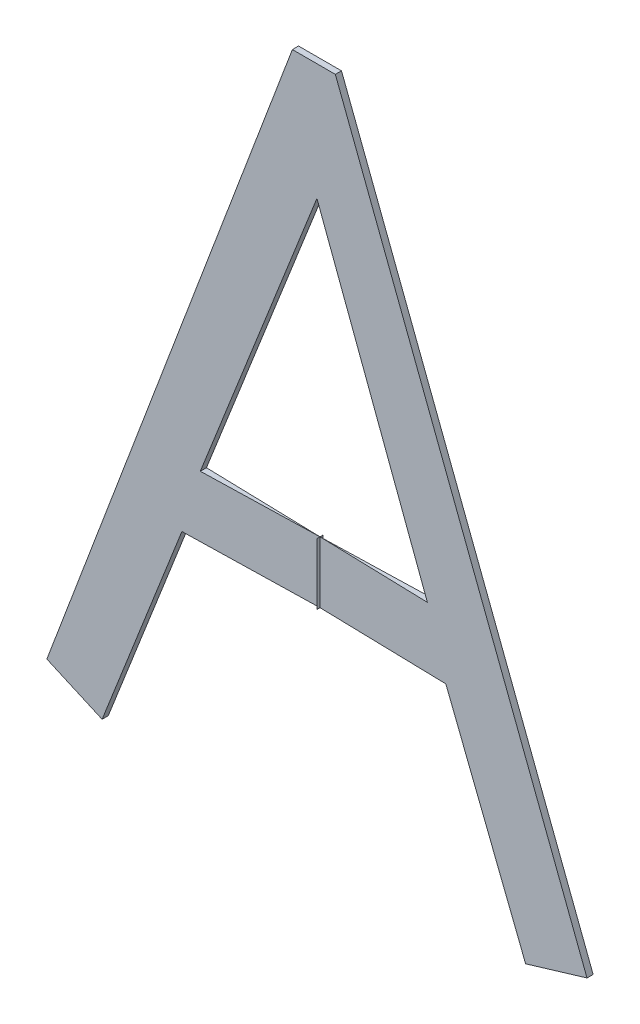
ISO-10303-21;
HEADER;
FILE_DESCRIPTION(('STEP AP214'),'2;1');
FILE_NAME('part.step','',(''),(''),'','','');
FILE_SCHEMA(('AUTOMOTIVE_DESIGN { 1 0 10303 214 1 1 1 1 }'));
ENDSEC;
DATA;
#1=APPLICATION_CONTEXT('core data for automotive mechanical design processes');
#2=APPLICATION_PROTOCOL_DEFINITION('international standard','automotive_design',2000,#1);
#3=PRODUCT_CONTEXT('',#1,'mechanical');
#4=PRODUCT('Part','Part','',(#3));
#5=PRODUCT_RELATED_PRODUCT_CATEGORY('part','',(#4));
#6=PRODUCT_DEFINITION_FORMATION('','',#4);
#7=PRODUCT_DEFINITION_CONTEXT('part definition',#1,'design');
#8=PRODUCT_DEFINITION('design','',#6,#7);
#9=PRODUCT_DEFINITION_SHAPE('','',#8);
#10=(LENGTH_UNIT() NAMED_UNIT(*) SI_UNIT(.MILLI.,.METRE.));
#11=(NAMED_UNIT(*) PLANE_ANGLE_UNIT() SI_UNIT($,.RADIAN.));
#12=(NAMED_UNIT(*) SI_UNIT($,.STERADIAN.) SOLID_ANGLE_UNIT());
#13=UNCERTAINTY_MEASURE_WITH_UNIT(LENGTH_MEASURE(1.E-05),#10,'distance_accuracy_value','');
#14=(GEOMETRIC_REPRESENTATION_CONTEXT(3) GLOBAL_UNCERTAINTY_ASSIGNED_CONTEXT((#13)) GLOBAL_UNIT_ASSIGNED_CONTEXT((#10,
#11,#12)) REPRESENTATION_CONTEXT('',''));
#15=CARTESIAN_POINT('',(0.,0.,0.));
#16=DIRECTION('',(0.,0.,1.));
#17=DIRECTION('',(1.,0.,0.));
#18=AXIS2_PLACEMENT_3D('',#15,#16,#17);
#19=CARTESIAN_POINT('',(-0.3499993,-0.5499989,0.01));
#20=DIRECTION('',(0.,0.,1.));
#21=DIRECTION('',(1.,0.,0.));
#22=AXIS2_PLACEMENT_3D('',#19,#20,#21);
#23=PLANE('',#22);
#24=DIRECTION('',(0.913811548620257,-0.406138466053448,0.));
#25=VECTOR('',#24,1.);
#26=CARTESIAN_POINT('',(-0.43999912,-0.50999898,0.01));
#27=LINE('',#26,#25);
#28=CARTESIAN_POINT('',(-0.43999912,-0.50999898,0.01));
#29=VERTEX_POINT('',#28);
#30=CARTESIAN_POINT('',(-0.3499993,-0.5499989,0.01));
#31=VERTEX_POINT('',#30);
#32=EDGE_CURVE('P0_E170',#29,#31,#27,.T.);
#33=ORIENTED_EDGE('',*,*,#32,.T.);
#34=DIRECTION('',(0.366524518382491,0.930408392817092,0.));
#35=VECTOR('',#34,1.);
#36=CARTESIAN_POINT('',(-0.3499993,-0.5499989,0.01));
#37=LINE('',#36,#35);
#38=CARTESIAN_POINT('',(-0.21999956000007,-0.219999559999986,0.01));
#39=VERTEX_POINT('',#38);
#40=EDGE_CURVE('P0_E167',#31,#39,#37,.T.);
#41=ORIENTED_EDGE('',*,*,#40,.T.);
#42=DIRECTION('',(1.,0.,0.));
#43=VECTOR('',#42,1.);
#44=CARTESIAN_POINT('',(-0.3499993,-0.21999956,0.01));
#45=LINE('',#44,#43);
#46=CARTESIAN_POINT('',(0.,-0.21999956,0.005));
#47=VERTEX_POINT('',#46);
#48=EDGE_CURVE('P0_E190',#39,#47,#45,.T.);
#49=ORIENTED_EDGE('',*,*,#48,.T.);
#50=DIRECTION('',(1.,0.,0.));
#51=VECTOR('',#50,1.);
#52=CARTESIAN_POINT('',(-0.3499993,-0.21999956,0.01));
#53=LINE('',#52,#51);
#54=CARTESIAN_POINT('',(0.21000212,-0.21999956,0.01));
#55=VERTEX_POINT('',#54);
#56=EDGE_CURVE('P0_E188',#47,#55,#53,.T.);
#57=ORIENTED_EDGE('',*,*,#56,.T.);
#58=DIRECTION('',(0.366524518382491,-0.930408392817092,0.));
#59=VECTOR('',#58,1.);
#60=CARTESIAN_POINT('',(0.21000212,-0.21999956,0.01));
#61=LINE('',#60,#59);
#62=CARTESIAN_POINT('',(0.34000186,-0.5499989,0.01));
#63=VERTEX_POINT('',#62);
#64=EDGE_CURVE('P0_E185',#55,#63,#61,.T.);
#65=ORIENTED_EDGE('',*,*,#64,.T.);
#66=DIRECTION('',(0.957826285221152,0.287347885566345,0.));
#67=VECTOR('',#66,1.);
#68=CARTESIAN_POINT('',(0.34000186,-0.5499989,0.01));
#69=LINE('',#68,#67);
#70=CARTESIAN_POINT('',(0.44000166,-0.51999896,0.01));
#71=VERTEX_POINT('',#70);
#72=EDGE_CURVE('P0_E182',#63,#71,#69,.T.);
#73=ORIENTED_EDGE('',*,*,#72,.T.);
#74=DIRECTION('',(-0.357810384585248,0.933794264644497,0.));
#75=VECTOR('',#74,1.);
#76=CARTESIAN_POINT('',(0.44000166,-0.51999896,0.01));
#77=LINE('',#76,#75);
#78=CARTESIAN_POINT('',(0.0299999400000101,0.55000144,0.01));
#79=VERTEX_POINT('',#78);
#80=EDGE_CURVE('P0_E179',#71,#79,#77,.T.);
#81=ORIENTED_EDGE('',*,*,#80,.T.);
#82=DIRECTION('',(1.,0.,0.));
#83=VECTOR('',#82,1.);
#84=CARTESIAN_POINT('',(-0.3499993,0.55000144,0.01));
#85=LINE('',#84,#83);
#86=CARTESIAN_POINT('',(-0.03999991999999,0.55000144,0.01));
#87=VERTEX_POINT('',#86);
#88=EDGE_CURVE('P0_E176',#79,#87,#85,.F.);
#89=ORIENTED_EDGE('',*,*,#88,.T.);
#90=DIRECTION('',(-0.353056511883147,-0.935601998403651,0.));
#91=VECTOR('',#90,1.);
#92=CARTESIAN_POINT('',(-0.03999991999999,0.55000144,0.01));
#93=LINE('',#92,#91);
#94=EDGE_CURVE('P0_E173',#87,#29,#93,.T.);
#95=ORIENTED_EDGE('',*,*,#94,.T.);
#96=EDGE_LOOP('',(#33,#41,#49,#57,#65,#73,#81,#89,#95));
#97=FACE_BOUND('',#96,.T.);
#98=DIRECTION('',(0.351126156502094,-0.936328159471916,0.));
#99=VECTOR('',#98,1.);
#100=CARTESIAN_POINT('',(0.,0.36000182,0.01));
#101=LINE('',#100,#99);
#102=CARTESIAN_POINT('',(0.,0.36000182,0.01));
#103=VERTEX_POINT('',#102);
#104=CARTESIAN_POINT('',(0.18000218,-0.11999976,0.01));
#105=VERTEX_POINT('',#104);
#106=EDGE_CURVE('P0_E201',#103,#105,#101,.T.);
#107=ORIENTED_EDGE('',*,*,#106,.T.);
#108=DIRECTION('',(1.,0.,0.));
#109=VECTOR('',#108,1.);
#110=CARTESIAN_POINT('',(-0.3499993,-0.11999976,0.01));
#111=LINE('',#110,#109);
#112=CARTESIAN_POINT('',(0.,-0.11999976,0.005));
#113=VERTEX_POINT('',#112);
#114=EDGE_CURVE('P0_E107',#105,#113,#111,.F.);
#115=ORIENTED_EDGE('',*,*,#114,.T.);
#116=DIRECTION('',(1.,0.,0.));
#117=VECTOR('',#116,1.);
#118=CARTESIAN_POINT('',(-0.3499993,-0.11999976,0.01));
#119=LINE('',#118,#117);
#120=CARTESIAN_POINT('',(-0.18999962,-0.11999976,0.01));
#121=VERTEX_POINT('',#120);
#122=EDGE_CURVE('P0_E105',#113,#121,#119,.F.);
#123=ORIENTED_EDGE('',*,*,#122,.T.);
#124=DIRECTION('',(0.368046767241236,0.929807279560273,0.));
#125=VECTOR('',#124,1.);
#126=CARTESIAN_POINT('',(-0.18999962,-0.11999976,0.01));
#127=LINE('',#126,#125);
#128=EDGE_CURVE('P0_E101',#121,#103,#127,.T.);
#129=ORIENTED_EDGE('',*,*,#128,.T.);
#130=EDGE_LOOP('',(#107,#115,#123,#129));
#131=FACE_BOUND('',#130,.T.);
#132=ADVANCED_FACE('P0_F17',(#97,#131),#23,.T.);
#133=CARTESIAN_POINT('',(0.,-0.11999976,0.));
#134=DIRECTION('',(0.,-1.,0.));
#135=DIRECTION('',(0.,0.,-1.));
#136=AXIS2_PLACEMENT_3D('',#133,#134,#135);
#137=PLANE('',#136);
#138=DIRECTION('',(0.,0.,1.));
#139=VECTOR('',#138,1.);
#140=CARTESIAN_POINT('',(-0.18999962,-0.11999976,0.));
#141=LINE('',#140,#139);
#142=CARTESIAN_POINT('',(-0.18999962,-0.11999976,0.));
#143=VERTEX_POINT('',#142);
#144=EDGE_CURVE('P0_E112',#143,#121,#141,.T.);
#145=ORIENTED_EDGE('',*,*,#144,.T.);
#146=ORIENTED_EDGE('',*,*,#122,.F.);
#147=DIRECTION('',(1.,0.,0.));
#148=VECTOR('',#147,1.);
#149=CARTESIAN_POINT('',(0.,-0.11999976,0.));
#150=LINE('',#149,#148);
#151=EDGE_CURVE('P0_E121',#113,#143,#150,.F.);
#152=ORIENTED_EDGE('',*,*,#151,.T.);
#153=EDGE_LOOP('',(#145,#146,#152));
#154=FACE_BOUND('',#153,.T.);
#155=ADVANCED_FACE('P0_F120',(#154),#137,.F.);
#156=CARTESIAN_POINT('',(-0.18999962,-0.11999976,0.));
#157=DIRECTION('',(-0.929807279560317,0.368046767241125,0.));
#158=DIRECTION('',(-0.368046767241125,-0.929807279560317,0.));
#159=AXIS2_PLACEMENT_3D('',#156,#157,#158);
#160=PLANE('',#159);
#161=DIRECTION('',(0.,0.,1.));
#162=VECTOR('',#161,1.);
#163=CARTESIAN_POINT('',(0.,0.36000182,0.));
#164=LINE('',#163,#162);
#165=CARTESIAN_POINT('',(0.,0.360001820000043,0.));
#166=VERTEX_POINT('',#165);
#167=EDGE_CURVE('P0_E118',#166,#103,#164,.T.);
#168=ORIENTED_EDGE('',*,*,#167,.T.);
#169=ORIENTED_EDGE('',*,*,#128,.F.);
#170=ORIENTED_EDGE('',*,*,#144,.F.);
#171=DIRECTION('',(-0.368046767241125,-0.929807279560317,0.));
#172=VECTOR('',#171,1.);
#173=CARTESIAN_POINT('',(-0.18999962,-0.11999976,0.));
#174=LINE('',#173,#172);
#175=EDGE_CURVE('P0_E161',#143,#166,#174,.F.);
#176=ORIENTED_EDGE('',*,*,#175,.T.);
#177=EDGE_LOOP('',(#168,#169,#170,#176));
#178=FACE_BOUND('',#177,.T.);
#179=ADVANCED_FACE('P0_F115',(#178),#160,.F.);
#180=CARTESIAN_POINT('',(0.,0.36000182,0.));
#181=DIRECTION('',(0.936328159471958,0.351126156501984,0.));
#182=DIRECTION('',(-0.351126156501984,0.936328159471958,0.));
#183=AXIS2_PLACEMENT_3D('',#180,#181,#182);
#184=PLANE('',#183);
#185=DIRECTION('',(0.,0.,-1.));
#186=VECTOR('',#185,1.);
#187=CARTESIAN_POINT('',(0.18000218,-0.11999976,0.));
#188=LINE('',#187,#186);
#189=CARTESIAN_POINT('',(0.180002179999968,-0.11999976,0.));
#190=VERTEX_POINT('',#189);
#191=EDGE_CURVE('P0_E198',#190,#105,#188,.F.);
#192=ORIENTED_EDGE('',*,*,#191,.T.);
#193=ORIENTED_EDGE('',*,*,#106,.F.);
#194=ORIENTED_EDGE('',*,*,#167,.F.);
#195=DIRECTION('',(-0.351126156501984,0.936328159471958,0.));
#196=VECTOR('',#195,1.);
#197=CARTESIAN_POINT('',(0.,0.36000182,0.));
#198=LINE('',#197,#196);
#199=EDGE_CURVE('P0_E156',#166,#190,#198,.F.);
#200=ORIENTED_EDGE('',*,*,#199,.T.);
#201=EDGE_LOOP('',(#192,#193,#194,#200));
#202=FACE_BOUND('',#201,.T.);
#203=ADVANCED_FACE('P0_F286',(#202),#184,.F.);
#204=CARTESIAN_POINT('',(0.18000218,-0.11999976,0.));
#205=DIRECTION('',(0.,-1.,0.));
#206=DIRECTION('',(0.,0.,-1.));
#207=AXIS2_PLACEMENT_3D('',#204,#205,#206);
#208=PLANE('',#207);
#209=ORIENTED_EDGE('',*,*,#114,.F.);
#210=ORIENTED_EDGE('',*,*,#191,.F.);
#211=DIRECTION('',(1.,0.,0.));
#212=VECTOR('',#211,1.);
#213=CARTESIAN_POINT('',(0.18000218,-0.11999976,0.));
#214=LINE('',#213,#212);
#215=EDGE_CURVE('P0_E151',#190,#113,#214,.F.);
#216=ORIENTED_EDGE('',*,*,#215,.T.);
#217=EDGE_LOOP('',(#209,#210,#216));
#218=FACE_BOUND('',#217,.T.);
#219=ADVANCED_FACE('P0_F283',(#218),#208,.F.);
#220=CARTESIAN_POINT('',(-0.21999956,-0.21999956,0.));
#221=DIRECTION('',(0.,1.,0.));
#222=DIRECTION('',(0.,0.,1.));
#223=AXIS2_PLACEMENT_3D('',#220,#221,#222);
#224=PLANE('',#223);
#225=ORIENTED_EDGE('',*,*,#48,.F.);
#226=DIRECTION('',(0.,0.,1.));
#227=VECTOR('',#226,1.);
#228=CARTESIAN_POINT('',(-0.21999956000014,-0.219999559999945,0.));
#229=LINE('',#228,#227);
#230=CARTESIAN_POINT('',(-0.21999956000015,-0.219999559999973,0.));
#231=VERTEX_POINT('',#230);
#232=EDGE_CURVE('P0_E164',#39,#231,#229,.F.);
#233=ORIENTED_EDGE('',*,*,#232,.T.);
#234=DIRECTION('',(1.,0.,0.));
#235=VECTOR('',#234,1.);
#236=CARTESIAN_POINT('',(-0.21999956,-0.21999956,0.));
#237=LINE('',#236,#235);
#238=EDGE_CURVE('P0_E146',#231,#47,#237,.T.);
#239=ORIENTED_EDGE('',*,*,#238,.T.);
#240=EDGE_LOOP('',(#225,#233,#239));
#241=FACE_BOUND('',#240,.T.);
#242=ADVANCED_FACE('P0_F221',(#241),#224,.F.);
#243=CARTESIAN_POINT('',(0.,-0.21999956,0.));
#244=DIRECTION('',(0.,1.,0.));
#245=DIRECTION('',(0.,0.,1.));
#246=AXIS2_PLACEMENT_3D('',#243,#244,#245);
#247=PLANE('',#246);
#248=DIRECTION('',(0.,0.,1.));
#249=VECTOR('',#248,1.);
#250=CARTESIAN_POINT('',(0.21000212,-0.21999956,0.));
#251=LINE('',#250,#249);
#252=CARTESIAN_POINT('',(0.21000212,-0.21999956,0.));
#253=VERTEX_POINT('',#252);
#254=EDGE_CURVE('P0_E187',#253,#55,#251,.T.);
#255=ORIENTED_EDGE('',*,*,#254,.T.);
#256=ORIENTED_EDGE('',*,*,#56,.F.);
#257=DIRECTION('',(1.,0.,0.));
#258=VECTOR('',#257,1.);
#259=CARTESIAN_POINT('',(0.,-0.21999956,0.));
#260=LINE('',#259,#258);
#261=EDGE_CURVE('P0_E143',#47,#253,#260,.T.);
#262=ORIENTED_EDGE('',*,*,#261,.T.);
#263=EDGE_LOOP('',(#255,#256,#262));
#264=FACE_BOUND('',#263,.T.);
#265=ADVANCED_FACE('P0_F253',(#264),#247,.F.);
#266=CARTESIAN_POINT('',(0.21000212,-0.21999956,0.));
#267=DIRECTION('',(0.930408392817247,0.366524518382097,0.));
#268=DIRECTION('',(-0.366524518382097,0.930408392817247,0.));
#269=AXIS2_PLACEMENT_3D('',#266,#267,#268);
#270=PLANE('',#269);
#271=DIRECTION('',(0.,0.,1.));
#272=VECTOR('',#271,1.);
#273=CARTESIAN_POINT('',(0.34000186,-0.5499989,0.));
#274=LINE('',#273,#272);
#275=CARTESIAN_POINT('',(0.340001859999928,-0.549998900000022,0.));
#276=VERTEX_POINT('',#275);
#277=EDGE_CURVE('P0_E184',#276,#63,#274,.T.);
#278=ORIENTED_EDGE('',*,*,#277,.T.);
#279=ORIENTED_EDGE('',*,*,#64,.F.);
#280=ORIENTED_EDGE('',*,*,#254,.F.);
#281=DIRECTION('',(-0.366524518382097,0.930408392817247,0.));
#282=VECTOR('',#281,1.);
#283=CARTESIAN_POINT('',(0.21000212,-0.21999956,0.));
#284=LINE('',#283,#282);
#285=EDGE_CURVE('P0_E140',#253,#276,#284,.F.);
#286=ORIENTED_EDGE('',*,*,#285,.T.);
#287=EDGE_LOOP('',(#278,#279,#280,#286));
#288=FACE_BOUND('',#287,.T.);
#289=ADVANCED_FACE('P0_F250',(#288),#270,.F.);
#290=CARTESIAN_POINT('',(0.34000186,-0.5499989,0.));
#291=DIRECTION('',(-0.28734788556607,0.957826285221234,0.));
#292=DIRECTION('',(-0.957826285221234,-0.28734788556607,0.));
#293=AXIS2_PLACEMENT_3D('',#290,#291,#292);
#294=PLANE('',#293);
#295=DIRECTION('',(0.,0.,1.));
#296=VECTOR('',#295,1.);
#297=CARTESIAN_POINT('',(0.44000166,-0.51999896,0.));
#298=LINE('',#297,#296);
#299=CARTESIAN_POINT('',(0.440001660000005,-0.519998960000014,0.));
#300=VERTEX_POINT('',#299);
#301=EDGE_CURVE('P0_E181',#300,#71,#298,.T.);
#302=ORIENTED_EDGE('',*,*,#301,.T.);
#303=ORIENTED_EDGE('',*,*,#72,.F.);
#304=ORIENTED_EDGE('',*,*,#277,.F.);
#305=DIRECTION('',(-0.957826285221234,-0.28734788556607,0.));
#306=VECTOR('',#305,1.);
#307=CARTESIAN_POINT('',(0.34000186,-0.5499989,0.));
#308=LINE('',#307,#306);
#309=EDGE_CURVE('P0_E137',#276,#300,#308,.F.);
#310=ORIENTED_EDGE('',*,*,#309,.T.);
#311=EDGE_LOOP('',(#302,#303,#304,#310));
#312=FACE_BOUND('',#311,.T.);
#313=ADVANCED_FACE('P0_F246',(#312),#294,.F.);
#314=CARTESIAN_POINT('',(0.44000166,-0.51999896,0.));
#315=DIRECTION('',(-0.933794264644644,-0.357810384584864,0.));
#316=DIRECTION('',(0.357810384584864,-0.933794264644644,0.));
#317=AXIS2_PLACEMENT_3D('',#314,#315,#316);
#318=PLANE('',#317);
#319=DIRECTION('',(0.,0.,-1.));
#320=VECTOR('',#319,1.);
#321=CARTESIAN_POINT('',(0.02999994000001,0.55000144,0.));
#322=LINE('',#321,#320);
#323=CARTESIAN_POINT('',(0.0299999400002628,0.55000144,0.));
#324=VERTEX_POINT('',#323);
#325=EDGE_CURVE('P0_E178',#324,#79,#322,.F.);
#326=ORIENTED_EDGE('',*,*,#325,.T.);
#327=ORIENTED_EDGE('',*,*,#80,.F.);
#328=ORIENTED_EDGE('',*,*,#301,.F.);
#329=DIRECTION('',(0.357810384584864,-0.933794264644644,0.));
#330=VECTOR('',#329,1.);
#331=CARTESIAN_POINT('',(0.44000166,-0.51999896,0.));
#332=LINE('',#331,#330);
#333=EDGE_CURVE('P0_E134',#300,#324,#332,.F.);
#334=ORIENTED_EDGE('',*,*,#333,.T.);
#335=EDGE_LOOP('',(#326,#327,#328,#334));
#336=FACE_BOUND('',#335,.T.);
#337=ADVANCED_FACE('P0_F242',(#336),#318,.F.);
#338=CARTESIAN_POINT('',(0.02999994000001,0.55000144,0.));
#339=DIRECTION('',(0.,-1.,0.));
#340=DIRECTION('',(0.,0.,-1.));
#341=AXIS2_PLACEMENT_3D('',#338,#339,#340);
#342=PLANE('',#341);
#343=DIRECTION('',(0.,0.,1.));
#344=VECTOR('',#343,1.);
#345=CARTESIAN_POINT('',(-0.03999991999999,0.55000144,0.));
#346=LINE('',#345,#344);
#347=CARTESIAN_POINT('',(-0.03999991999999,0.55000144,0.));
#348=VERTEX_POINT('',#347);
#349=EDGE_CURVE('P0_E175',#348,#87,#346,.T.);
#350=ORIENTED_EDGE('',*,*,#349,.T.);
#351=ORIENTED_EDGE('',*,*,#88,.F.);
#352=ORIENTED_EDGE('',*,*,#325,.F.);
#353=DIRECTION('',(1.,0.,0.));
#354=VECTOR('',#353,1.);
#355=CARTESIAN_POINT('',(0.02999994000001,0.55000144,0.));
#356=LINE('',#355,#354);
#357=EDGE_CURVE('P0_E131',#324,#348,#356,.F.);
#358=ORIENTED_EDGE('',*,*,#357,.T.);
#359=EDGE_LOOP('',(#350,#351,#352,#358));
#360=FACE_BOUND('',#359,.T.);
#361=ADVANCED_FACE('P0_F238',(#360),#342,.F.);
#362=CARTESIAN_POINT('',(-0.03999991999999,0.55000144,0.));
#363=DIRECTION('',(0.935601998403743,-0.353056511882903,0.));
#364=DIRECTION('',(0.353056511882903,0.935601998403743,0.));
#365=AXIS2_PLACEMENT_3D('',#362,#363,#364);
#366=PLANE('',#365);
#367=DIRECTION('',(0.,0.,1.));
#368=VECTOR('',#367,1.);
#369=CARTESIAN_POINT('',(-0.43999912,-0.50999898,0.));
#370=LINE('',#369,#368);
#371=CARTESIAN_POINT('',(-0.439999119999865,-0.50999898000006,0.));
#372=VERTEX_POINT('',#371);
#373=EDGE_CURVE('P0_E172',#372,#29,#370,.T.);
#374=ORIENTED_EDGE('',*,*,#373,.T.);
#375=ORIENTED_EDGE('',*,*,#94,.F.);
#376=ORIENTED_EDGE('',*,*,#349,.F.);
#377=DIRECTION('',(0.353056511882903,0.935601998403743,0.));
#378=VECTOR('',#377,1.);
#379=CARTESIAN_POINT('',(-0.03999991999999,0.55000144,0.));
#380=LINE('',#379,#378);
#381=EDGE_CURVE('P0_E128',#348,#372,#380,.F.);
#382=ORIENTED_EDGE('',*,*,#381,.T.);
#383=EDGE_LOOP('',(#374,#375,#376,#382));
#384=FACE_BOUND('',#383,.T.);
#385=ADVANCED_FACE('P0_F234',(#384),#366,.F.);
#386=CARTESIAN_POINT('',(-0.43999912,-0.50999898,0.));
#387=DIRECTION('',(0.406138466053169,0.913811548620381,0.));
#388=DIRECTION('',(-0.913811548620381,0.406138466053169,0.));
#389=AXIS2_PLACEMENT_3D('',#386,#387,#388);
#390=PLANE('',#389);
#391=DIRECTION('',(0.,0.,1.));
#392=VECTOR('',#391,1.);
#393=CARTESIAN_POINT('',(-0.3499993,-0.5499989,0.));
#394=LINE('',#393,#392);
#395=CARTESIAN_POINT('',(-0.349999299999995,-0.549998899999986,0.));
#396=VERTEX_POINT('',#395);
#397=EDGE_CURVE('P0_E34',#396,#31,#394,.T.);
#398=ORIENTED_EDGE('',*,*,#397,.T.);
#399=ORIENTED_EDGE('',*,*,#32,.F.);
#400=ORIENTED_EDGE('',*,*,#373,.F.);
#401=DIRECTION('',(-0.913811548620381,0.406138466053169,0.));
#402=VECTOR('',#401,1.);
#403=CARTESIAN_POINT('',(-0.43999912,-0.50999898,0.));
#404=LINE('',#403,#402);
#405=EDGE_CURVE('P0_E26',#372,#396,#404,.F.);
#406=ORIENTED_EDGE('',*,*,#405,.T.);
#407=EDGE_LOOP('',(#398,#399,#400,#406));
#408=FACE_BOUND('',#407,.T.);
#409=ADVANCED_FACE('P0_F230',(#408),#390,.F.);
#410=CARTESIAN_POINT('',(-0.3499993,-0.5499989,0.));
#411=DIRECTION('',(-0.930408392817247,0.366524518382097,0.));
#412=DIRECTION('',(-0.366524518382097,-0.930408392817247,0.));
#413=AXIS2_PLACEMENT_3D('',#410,#411,#412);
#414=PLANE('',#413);
#415=ORIENTED_EDGE('',*,*,#232,.F.);
#416=ORIENTED_EDGE('',*,*,#40,.F.);
#417=ORIENTED_EDGE('',*,*,#397,.F.);
#418=DIRECTION('',(-0.366524518382097,-0.930408392817247,0.));
#419=VECTOR('',#418,1.);
#420=CARTESIAN_POINT('',(-0.3499993,-0.5499989,0.));
#421=LINE('',#420,#419);
#422=EDGE_CURVE('P0_E11',#396,#231,#421,.F.);
#423=ORIENTED_EDGE('',*,*,#422,.T.);
#424=EDGE_LOOP('',(#415,#416,#417,#423));
#425=FACE_BOUND('',#424,.T.);
#426=ADVANCED_FACE('P0_F222',(#425),#414,.F.);
#427=CARTESIAN_POINT('',(-0.3499993,-0.5499989,0.));
#428=DIRECTION('',(0.,0.,1.));
#429=DIRECTION('',(1.,0.,0.));
#430=AXIS2_PLACEMENT_3D('',#427,#428,#429);
#431=PLANE('',#430);
#432=ORIENTED_EDGE('',*,*,#405,.F.);
#433=ORIENTED_EDGE('',*,*,#381,.F.);
#434=ORIENTED_EDGE('',*,*,#357,.F.);
#435=ORIENTED_EDGE('',*,*,#333,.F.);
#436=ORIENTED_EDGE('',*,*,#309,.F.);
#437=ORIENTED_EDGE('',*,*,#285,.F.);
#438=ORIENTED_EDGE('',*,*,#261,.F.);
#439=ORIENTED_EDGE('',*,*,#238,.F.);
#440=ORIENTED_EDGE('',*,*,#422,.F.);
#441=EDGE_LOOP('',(#432,#433,#434,#435,#436,#437,#438,#439,#440));
#442=FACE_BOUND('',#441,.T.);
#443=ORIENTED_EDGE('',*,*,#199,.F.);
#444=ORIENTED_EDGE('',*,*,#175,.F.);
#445=ORIENTED_EDGE('',*,*,#151,.F.);
#446=ORIENTED_EDGE('',*,*,#215,.F.);
#447=EDGE_LOOP('',(#443,#444,#445,#446));
#448=FACE_BOUND('',#447,.T.);
#449=ADVANCED_FACE('P0_F225',(#442,#448),#431,.F.);
#450=CLOSED_SHELL('',(#132,#155,#179,#203,#219,#242,#265,#289,#313,#337,#361,#385,#409,#426,#449));
#451=MANIFOLD_SOLID_BREP('P0_B1',#450);
#452=CARTESIAN_POINT('',(0.,-0.11999976,0.));
#453=DIRECTION('',(1.,0.,0.));
#454=DIRECTION('',(0.,0.,-1.));
#455=AXIS2_PLACEMENT_3D('',#452,#453,#454);
#456=PLANE('',#455);
#457=DIRECTION('',(0.,0.,-1.));
#458=VECTOR('',#457,1.);
#459=CARTESIAN_POINT('',(0.,-0.21999956,0.));
#460=LINE('',#459,#458);
#461=CARTESIAN_POINT('',(0.,-0.21999956,0.01));
#462=VERTEX_POINT('',#461);
#463=CARTESIAN_POINT('',(0.,-0.21999956,0.));
#464=VERTEX_POINT('',#463);
#465=EDGE_CURVE('P1_E24',#462,#464,#460,.T.);
#466=ORIENTED_EDGE('',*,*,#465,.T.);
#467=DIRECTION('',(0.,1.,0.));
#468=VECTOR('',#467,1.);
#469=CARTESIAN_POINT('',(0.,-0.11999976,0.));
#470=LINE('',#469,#468);
#471=CARTESIAN_POINT('',(0.,-0.11999976,0.));
#472=VERTEX_POINT('',#471);
#473=EDGE_CURVE('P1_E11',#464,#472,#470,.T.);
#474=ORIENTED_EDGE('',*,*,#473,.T.);
#475=DIRECTION('',(0.,0.,-1.));
#476=VECTOR('',#475,1.);
#477=CARTESIAN_POINT('',(0.,-0.11999976,0.));
#478=LINE('',#477,#476);
#479=CARTESIAN_POINT('',(0.,-0.11999976,0.01));
#480=VERTEX_POINT('',#479);
#481=EDGE_CURVE('P1_E18',#472,#480,#478,.F.);
#482=ORIENTED_EDGE('',*,*,#481,.T.);
#483=DIRECTION('',(0.,1.,0.));
#484=VECTOR('',#483,1.);
#485=CARTESIAN_POINT('',(0.,-0.11999976,0.01));
#486=LINE('',#485,#484);
#487=EDGE_CURVE('P1_E38',#480,#462,#486,.F.);
#488=ORIENTED_EDGE('',*,*,#487,.T.);
#489=EDGE_LOOP('',(#466,#474,#482,#488));
#490=FACE_BOUND('',#489,.T.);
#491=ADVANCED_FACE('P1_F17',(#490),#456,.T.);
#492=OPEN_SHELL('',(#491));
#493=SHELL_BASED_SURFACE_MODEL('P1_B1',(#492));
#494=ADVANCED_BREP_SHAPE_REPRESENTATION('',(#18,#451),#14);
#495=MANIFOLD_SURFACE_SHAPE_REPRESENTATION('',(#18,#493),#14);
#496=SHAPE_REPRESENTATION('',(#18),#14);
#497=SHAPE_DEFINITION_REPRESENTATION(#9,#496);
#498=SHAPE_REPRESENTATION_RELATIONSHIP('','',#496,#494);
#499=SHAPE_REPRESENTATION_RELATIONSHIP('','',#496,#495);
ENDSEC;
END-ISO-10303-21;
